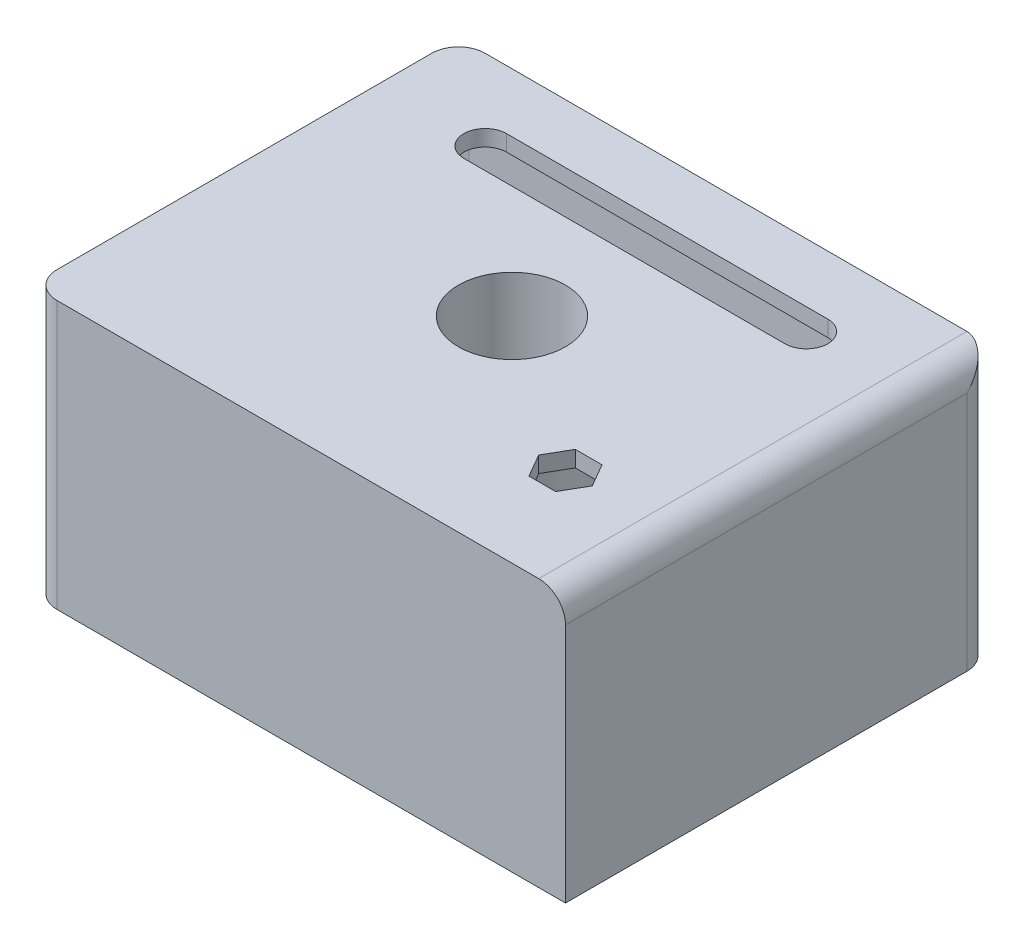
ISO-10303-21;
HEADER;
FILE_DESCRIPTION(('STEP AP214'),'2;1');
FILE_NAME('part.step','',(''),(''),'','','');
FILE_SCHEMA(('AUTOMOTIVE_DESIGN { 1 0 10303 214 1 1 1 1 }'));
ENDSEC;
DATA;
#1=APPLICATION_CONTEXT('core data for automotive mechanical design processes');
#2=APPLICATION_PROTOCOL_DEFINITION('international standard','automotive_design',2000,#1);
#3=PRODUCT_CONTEXT('',#1,'mechanical');
#4=PRODUCT('Part','Part','',(#3));
#5=PRODUCT_RELATED_PRODUCT_CATEGORY('part','',(#4));
#6=PRODUCT_DEFINITION_FORMATION('','',#4);
#7=PRODUCT_DEFINITION_CONTEXT('part definition',#1,'design');
#8=PRODUCT_DEFINITION('design','',#6,#7);
#9=PRODUCT_DEFINITION_SHAPE('','',#8);
#10=(LENGTH_UNIT() NAMED_UNIT(*) SI_UNIT(.MILLI.,.METRE.));
#11=(NAMED_UNIT(*) PLANE_ANGLE_UNIT() SI_UNIT($,.RADIAN.));
#12=(NAMED_UNIT(*) SI_UNIT($,.STERADIAN.) SOLID_ANGLE_UNIT());
#13=UNCERTAINTY_MEASURE_WITH_UNIT(LENGTH_MEASURE(1.E-05),#10,'distance_accuracy_value','');
#14=(GEOMETRIC_REPRESENTATION_CONTEXT(3) GLOBAL_UNCERTAINTY_ASSIGNED_CONTEXT((#13)) GLOBAL_UNIT_ASSIGNED_CONTEXT((#10,
#11,#12)) REPRESENTATION_CONTEXT('',''));
#15=CARTESIAN_POINT('',(0.,0.,0.));
#16=DIRECTION('',(0.,0.,1.));
#17=DIRECTION('',(1.,0.,0.));
#18=AXIS2_PLACEMENT_3D('',#15,#16,#17);
#19=CARTESIAN_POINT('',(0.,0.,0.));
#20=DIRECTION('',(0.,-1.,0.));
#21=DIRECTION('',(0.,0.,-1.));
#22=AXIS2_PLACEMENT_3D('',#19,#20,#21);
#23=PLANE('',#22);
#24=DIRECTION('',(0.,0.,1.));
#25=VECTOR('',#24,1.);
#26=CARTESIAN_POINT('',(-50.,0.,40.));
#27=LINE('',#26,#25);
#28=CARTESIAN_POINT('',(-50.,0.,-35.));
#29=VERTEX_POINT('',#28);
#30=CARTESIAN_POINT('',(-50.,0.,35.));
#31=VERTEX_POINT('',#30);
#32=EDGE_CURVE('E436',#29,#31,#27,.T.);
#33=ORIENTED_EDGE('',*,*,#32,.F.);
#34=CARTESIAN_POINT('',(-45.,0.,-35.));
#35=DIRECTION('',(0.,-1.,0.));
#36=DIRECTION('',(0.,0.,-1.));
#37=AXIS2_PLACEMENT_3D('',#34,#35,#36);
#38=CIRCLE('',#37,5.);
#39=CARTESIAN_POINT('',(-45.,0.,-40.));
#40=VERTEX_POINT('',#39);
#41=EDGE_CURVE('E466',#29,#40,#38,.T.);
#42=ORIENTED_EDGE('',*,*,#41,.T.);
#43=DIRECTION('',(-1.,0.,0.));
#44=VECTOR('',#43,1.);
#45=CARTESIAN_POINT('',(-50.,0.,-40.));
#46=LINE('',#45,#44);
#47=CARTESIAN_POINT('',(45.,0.,-40.));
#48=VERTEX_POINT('',#47);
#49=EDGE_CURVE('E427',#48,#40,#46,.T.);
#50=ORIENTED_EDGE('',*,*,#49,.F.);
#51=CARTESIAN_POINT('',(45.,0.,-35.));
#52=DIRECTION('',(0.,-1.,0.));
#53=DIRECTION('',(0.,0.,-1.));
#54=AXIS2_PLACEMENT_3D('',#51,#52,#53);
#55=CIRCLE('',#54,5.);
#56=CARTESIAN_POINT('',(50.,0.,-35.));
#57=VERTEX_POINT('',#56);
#58=EDGE_CURVE('E463',#48,#57,#55,.T.);
#59=ORIENTED_EDGE('',*,*,#58,.T.);
#60=DIRECTION('',(0.,0.,-1.));
#61=VECTOR('',#60,1.);
#62=CARTESIAN_POINT('',(50.,0.,40.));
#63=LINE('',#62,#61);
#64=CARTESIAN_POINT('',(50.,0.,40.));
#65=VERTEX_POINT('',#64);
#66=EDGE_CURVE('E444',#65,#57,#63,.T.);
#67=ORIENTED_EDGE('',*,*,#66,.F.);
#68=DIRECTION('',(1.,0.,0.));
#69=VECTOR('',#68,1.);
#70=CARTESIAN_POINT('',(-50.,0.,40.));
#71=LINE('',#70,#69);
#72=CARTESIAN_POINT('',(-45.,0.,40.));
#73=VERTEX_POINT('',#72);
#74=EDGE_CURVE('E440',#73,#65,#71,.T.);
#75=ORIENTED_EDGE('',*,*,#74,.F.);
#76=CARTESIAN_POINT('',(-45.,0.,35.));
#77=DIRECTION('',(0.,-1.,0.));
#78=DIRECTION('',(0.,0.,-1.));
#79=AXIS2_PLACEMENT_3D('',#76,#77,#78);
#80=CIRCLE('',#79,5.);
#81=EDGE_CURVE('E460',#73,#31,#80,.T.);
#82=ORIENTED_EDGE('',*,*,#81,.T.);
#83=EDGE_LOOP('',(#33,#42,#50,#59,#67,#75,#82));
#84=FACE_BOUND('',#83,.T.);
#85=CARTESIAN_POINT('',(-45.,0.,-35.));
#86=DIRECTION('',(0.,-1.,0.));
#87=DIRECTION('',(0.,0.,-1.));
#88=AXIS2_PLACEMENT_3D('',#85,#86,#87);
#89=CIRCLE('',#88,2.);
#90=CARTESIAN_POINT('',(-47.,0.,-35.));
#91=VERTEX_POINT('',#90);
#92=CARTESIAN_POINT('',(-45.,0.,-37.));
#93=VERTEX_POINT('',#92);
#94=EDGE_CURVE('E390',#91,#93,#89,.T.);
#95=ORIENTED_EDGE('',*,*,#94,.F.);
#96=DIRECTION('',(0.,0.,1.));
#97=VECTOR('',#96,1.);
#98=CARTESIAN_POINT('',(-47.,0.,0.));
#99=LINE('',#98,#97);
#100=CARTESIAN_POINT('',(-47.,0.,35.));
#101=VERTEX_POINT('',#100);
#102=EDGE_CURVE('E384',#91,#101,#99,.T.);
#103=ORIENTED_EDGE('',*,*,#102,.T.);
#104=CARTESIAN_POINT('',(-45.,0.,35.));
#105=DIRECTION('',(0.,-1.,0.));
#106=DIRECTION('',(0.,0.,-1.));
#107=AXIS2_PLACEMENT_3D('',#104,#105,#106);
#108=CIRCLE('',#107,2.);
#109=CARTESIAN_POINT('',(-45.,0.,37.));
#110=VERTEX_POINT('',#109);
#111=EDGE_CURVE('E338',#110,#101,#108,.T.);
#112=ORIENTED_EDGE('',*,*,#111,.F.);
#113=DIRECTION('',(1.,0.,0.));
#114=VECTOR('',#113,1.);
#115=CARTESIAN_POINT('',(0.,0.,37.));
#116=LINE('',#115,#114);
#117=CARTESIAN_POINT('',(47.,0.,37.));
#118=VERTEX_POINT('',#117);
#119=EDGE_CURVE('E394',#110,#118,#116,.T.);
#120=ORIENTED_EDGE('',*,*,#119,.T.);
#121=DIRECTION('',(0.,0.,-1.));
#122=VECTOR('',#121,1.);
#123=CARTESIAN_POINT('',(47.,0.,0.));
#124=LINE('',#123,#122);
#125=CARTESIAN_POINT('',(47.,0.,-35.));
#126=VERTEX_POINT('',#125);
#127=EDGE_CURVE('E401',#118,#126,#124,.T.);
#128=ORIENTED_EDGE('',*,*,#127,.T.);
#129=CARTESIAN_POINT('',(45.,0.,-35.));
#130=DIRECTION('',(0.,-1.,0.));
#131=DIRECTION('',(0.,0.,-1.));
#132=AXIS2_PLACEMENT_3D('',#129,#130,#131);
#133=CIRCLE('',#132,2.);
#134=CARTESIAN_POINT('',(45.,0.,-37.));
#135=VERTEX_POINT('',#134);
#136=EDGE_CURVE('E397',#135,#126,#133,.T.);
#137=ORIENTED_EDGE('',*,*,#136,.F.);
#138=DIRECTION('',(-1.,0.,0.));
#139=VECTOR('',#138,1.);
#140=CARTESIAN_POINT('',(0.,0.,-37.));
#141=LINE('',#140,#139);
#142=EDGE_CURVE('E334',#135,#93,#141,.T.);
#143=ORIENTED_EDGE('',*,*,#142,.T.);
#144=EDGE_LOOP('',(#95,#103,#112,#120,#128,#137,#143));
#145=FACE_BOUND('',#144,.T.);
#146=ADVANCED_FACE('F45',(#84,#145),#23,.T.);
#147=CARTESIAN_POINT('',(-50.,50.,40.));
#148=DIRECTION('',(1.,0.,0.));
#149=DIRECTION('',(0.,0.,-1.));
#150=AXIS2_PLACEMENT_3D('',#147,#148,#149);
#151=PLANE('',#150);
#152=DIRECTION('',(0.,0.,1.));
#153=VECTOR('',#152,1.);
#154=CARTESIAN_POINT('',(-50.,50.,40.));
#155=LINE('',#154,#153);
#156=CARTESIAN_POINT('',(-50.,50.,-35.));
#157=VERTEX_POINT('',#156);
#158=CARTESIAN_POINT('',(-50.,50.,35.));
#159=VERTEX_POINT('',#158);
#160=EDGE_CURVE('E422',#157,#159,#155,.T.);
#161=ORIENTED_EDGE('',*,*,#160,.F.);
#162=DIRECTION('',(0.,-1.,0.));
#163=VECTOR('',#162,1.);
#164=CARTESIAN_POINT('',(-50.,50.,-35.));
#165=LINE('',#164,#163);
#166=EDGE_CURVE('E456',#157,#29,#165,.T.);
#167=ORIENTED_EDGE('',*,*,#166,.T.);
#168=ORIENTED_EDGE('',*,*,#32,.T.);
#169=DIRECTION('',(0.,-1.,0.));
#170=VECTOR('',#169,1.);
#171=CARTESIAN_POINT('',(-50.,50.,35.));
#172=LINE('',#171,#170);
#173=EDGE_CURVE('E453',#31,#159,#172,.F.);
#174=ORIENTED_EDGE('',*,*,#173,.T.);
#175=EDGE_LOOP('',(#161,#167,#168,#174));
#176=FACE_BOUND('',#175,.T.);
#177=ADVANCED_FACE('F527',(#176),#151,.F.);
#178=CARTESIAN_POINT('',(-50.,50.,40.));
#179=DIRECTION('',(0.,0.,-1.));
#180=DIRECTION('',(-1.,0.,0.));
#181=AXIS2_PLACEMENT_3D('',#178,#179,#180);
#182=PLANE('',#181);
#183=DIRECTION('',(1.,0.,0.));
#184=VECTOR('',#183,1.);
#185=CARTESIAN_POINT('',(-50.,50.,40.));
#186=LINE('',#185,#184);
#187=CARTESIAN_POINT('',(-45.,50.,40.));
#188=VERTEX_POINT('',#187);
#189=CARTESIAN_POINT('',(45.,50.,40.));
#190=VERTEX_POINT('',#189);
#191=EDGE_CURVE('E426',#188,#190,#186,.T.);
#192=ORIENTED_EDGE('',*,*,#191,.F.);
#193=DIRECTION('',(0.,-1.,0.));
#194=VECTOR('',#193,1.);
#195=CARTESIAN_POINT('',(-45.,50.,40.));
#196=LINE('',#195,#194);
#197=EDGE_CURVE('E11',#188,#73,#196,.T.);
#198=ORIENTED_EDGE('',*,*,#197,.T.);
#199=ORIENTED_EDGE('',*,*,#74,.T.);
#200=DIRECTION('',(0.,-1.,0.));
#201=VECTOR('',#200,1.);
#202=CARTESIAN_POINT('',(50.,50.,40.));
#203=LINE('',#202,#201);
#204=CARTESIAN_POINT('',(50.,45.,40.));
#205=VERTEX_POINT('',#204);
#206=EDGE_CURVE('E435',#205,#65,#203,.T.);
#207=ORIENTED_EDGE('',*,*,#206,.F.);
#208=CARTESIAN_POINT('',(45.,45.,40.));
#209=DIRECTION('',(0.,0.,-1.));
#210=DIRECTION('',(-1.,0.,0.));
#211=AXIS2_PLACEMENT_3D('',#208,#209,#210);
#212=CIRCLE('',#211,5.);
#213=EDGE_CURVE('E55',#205,#190,#212,.F.);
#214=ORIENTED_EDGE('',*,*,#213,.T.);
#215=EDGE_LOOP('',(#192,#198,#199,#207,#214));
#216=FACE_BOUND('',#215,.T.);
#217=ADVANCED_FACE('F496',(#216),#182,.F.);
#218=CARTESIAN_POINT('',(50.,50.,40.));
#219=DIRECTION('',(-1.,0.,0.));
#220=DIRECTION('',(0.,0.,1.));
#221=AXIS2_PLACEMENT_3D('',#218,#219,#220);
#222=PLANE('',#221);
#223=ORIENTED_EDGE('',*,*,#66,.T.);
#224=DIRECTION('',(0.,-1.,0.));
#225=VECTOR('',#224,1.);
#226=CARTESIAN_POINT('',(50.,50.,-35.));
#227=LINE('',#226,#225);
#228=CARTESIAN_POINT('',(50.,45.,-35.));
#229=VERTEX_POINT('',#228);
#230=EDGE_CURVE('E488',#57,#229,#227,.F.);
#231=ORIENTED_EDGE('',*,*,#230,.T.);
#232=DIRECTION('',(0.,0.,-1.));
#233=VECTOR('',#232,1.);
#234=CARTESIAN_POINT('',(50.,45.,40.));
#235=LINE('',#234,#233);
#236=EDGE_CURVE('E485',#229,#205,#235,.F.);
#237=ORIENTED_EDGE('',*,*,#236,.T.);
#238=ORIENTED_EDGE('',*,*,#206,.T.);
#239=EDGE_LOOP('',(#223,#231,#237,#238));
#240=FACE_BOUND('',#239,.T.);
#241=ADVANCED_FACE('F532',(#240),#222,.F.);
#242=CARTESIAN_POINT('',(-50.,50.,-40.));
#243=DIRECTION('',(0.,0.,1.));
#244=DIRECTION('',(1.,0.,0.));
#245=AXIS2_PLACEMENT_3D('',#242,#243,#244);
#246=PLANE('',#245);
#247=ORIENTED_EDGE('',*,*,#49,.T.);
#248=DIRECTION('',(0.,-1.,0.));
#249=VECTOR('',#248,1.);
#250=CARTESIAN_POINT('',(-45.,50.,-40.));
#251=LINE('',#250,#249);
#252=CARTESIAN_POINT('',(-45.,50.,-40.));
#253=VERTEX_POINT('',#252);
#254=EDGE_CURVE('E473',#40,#253,#251,.F.);
#255=ORIENTED_EDGE('',*,*,#254,.T.);
#256=DIRECTION('',(-1.,0.,0.));
#257=VECTOR('',#256,1.);
#258=CARTESIAN_POINT('',(-50.,50.,-40.));
#259=LINE('',#258,#257);
#260=CARTESIAN_POINT('',(45.,50.,-40.));
#261=VERTEX_POINT('',#260);
#262=EDGE_CURVE('E431',#261,#253,#259,.T.);
#263=ORIENTED_EDGE('',*,*,#262,.F.);
#264=DIRECTION('',(0.,-1.,0.));
#265=VECTOR('',#264,1.);
#266=CARTESIAN_POINT('',(45.,50.,-40.));
#267=LINE('',#266,#265);
#268=EDGE_CURVE('E469',#261,#48,#267,.T.);
#269=ORIENTED_EDGE('',*,*,#268,.T.);
#270=EDGE_LOOP('',(#247,#255,#263,#269));
#271=FACE_BOUND('',#270,.T.);
#272=ADVANCED_FACE('F515',(#271),#246,.F.);
#273=CARTESIAN_POINT('',(0.,50.,0.));
#274=DIRECTION('',(0.,-1.,0.));
#275=DIRECTION('',(0.,0.,-1.));
#276=AXIS2_PLACEMENT_3D('',#273,#274,#275);
#277=PLANE('',#276);
#278=DIRECTION('',(-0.500000000000001,0.,-0.866025403784438));
#279=VECTOR('',#278,1.);
#280=CARTESIAN_POINT('',(35.,50.,20.));
#281=LINE('',#280,#279);
#282=CARTESIAN_POINT('',(35.,50.,20.));
#283=VERTEX_POINT('',#282);
#284=CARTESIAN_POINT('',(32.5,50.,15.6698729810778));
#285=VERTEX_POINT('',#284);
#286=EDGE_CURVE('E256',#283,#285,#281,.T.);
#287=ORIENTED_EDGE('',*,*,#286,.F.);
#288=DIRECTION('',(0.499999999999995,0.,-0.866025403784442));
#289=VECTOR('',#288,1.);
#290=CARTESIAN_POINT('',(32.5,50.,24.3301270189222));
#291=LINE('',#290,#289);
#292=CARTESIAN_POINT('',(32.5,50.,24.3301270189222));
#293=VERTEX_POINT('',#292);
#294=EDGE_CURVE('E62',#293,#283,#291,.T.);
#295=ORIENTED_EDGE('',*,*,#294,.F.);
#296=DIRECTION('',(1.,0.,0.));
#297=VECTOR('',#296,1.);
#298=CARTESIAN_POINT('',(27.5,50.,24.3301270189222));
#299=LINE('',#298,#297);
#300=CARTESIAN_POINT('',(27.5,50.,24.3301270189222));
#301=VERTEX_POINT('',#300);
#302=EDGE_CURVE('E236',#301,#293,#299,.T.);
#303=ORIENTED_EDGE('',*,*,#302,.F.);
#304=DIRECTION('',(0.500000000000007,0.,0.866025403784434));
#305=VECTOR('',#304,1.);
#306=CARTESIAN_POINT('',(25.,50.,20.));
#307=LINE('',#306,#305);
#308=CARTESIAN_POINT('',(25.,50.,20.));
#309=VERTEX_POINT('',#308);
#310=EDGE_CURVE('E240',#309,#301,#307,.T.);
#311=ORIENTED_EDGE('',*,*,#310,.F.);
#312=DIRECTION('',(-0.499999999999995,0.,0.866025403784442));
#313=VECTOR('',#312,1.);
#314=CARTESIAN_POINT('',(27.5,50.,15.6698729810778));
#315=LINE('',#314,#313);
#316=CARTESIAN_POINT('',(27.5,50.,15.6698729810778));
#317=VERTEX_POINT('',#316);
#318=EDGE_CURVE('E263',#317,#309,#315,.T.);
#319=ORIENTED_EDGE('',*,*,#318,.F.);
#320=DIRECTION('',(-1.,0.,0.));
#321=VECTOR('',#320,1.);
#322=CARTESIAN_POINT('',(32.5,50.,15.6698729810778));
#323=LINE('',#322,#321);
#324=EDGE_CURVE('E259',#285,#317,#323,.T.);
#325=ORIENTED_EDGE('',*,*,#324,.F.);
#326=EDGE_LOOP('',(#287,#295,#303,#311,#319,#325));
#327=FACE_BOUND('',#326,.T.);
#328=DIRECTION('',(1.,0.,0.));
#329=VECTOR('',#328,1.);
#330=CARTESIAN_POINT('',(-30.,50.,-21.));
#331=LINE('',#330,#329);
#332=CARTESIAN_POINT('',(-30.,50.,-21.));
#333=VERTEX_POINT('',#332);
#334=CARTESIAN_POINT('',(30.,50.,-21.));
#335=VERTEX_POINT('',#334);
#336=EDGE_CURVE('E305',#333,#335,#331,.T.);
#337=ORIENTED_EDGE('',*,*,#336,.F.);
#338=CARTESIAN_POINT('',(-30.,50.,-25.));
#339=DIRECTION('',(0.,1.,0.));
#340=DIRECTION('',(0.,0.,1.));
#341=AXIS2_PLACEMENT_3D('',#338,#339,#340);
#342=CIRCLE('',#341,4.);
#343=CARTESIAN_POINT('',(-30.,50.,-29.));
#344=VERTEX_POINT('',#343);
#345=EDGE_CURVE('E273',#344,#333,#342,.T.);
#346=ORIENTED_EDGE('',*,*,#345,.F.);
#347=DIRECTION('',(-1.,0.,0.));
#348=VECTOR('',#347,1.);
#349=CARTESIAN_POINT('',(-30.,50.,-29.));
#350=LINE('',#349,#348);
#351=CARTESIAN_POINT('',(30.,50.,-29.));
#352=VERTEX_POINT('',#351);
#353=EDGE_CURVE('E290',#352,#344,#350,.T.);
#354=ORIENTED_EDGE('',*,*,#353,.F.);
#355=CARTESIAN_POINT('',(30.,50.,-25.));
#356=DIRECTION('',(0.,1.,0.));
#357=DIRECTION('',(0.,0.,1.));
#358=AXIS2_PLACEMENT_3D('',#355,#356,#357);
#359=CIRCLE('',#358,4.);
#360=EDGE_CURVE('E309',#335,#352,#359,.T.);
#361=ORIENTED_EDGE('',*,*,#360,.F.);
#362=EDGE_LOOP('',(#337,#346,#354,#361));
#363=FACE_BOUND('',#362,.T.);
#364=CARTESIAN_POINT('',(0.,50.,0.));
#365=DIRECTION('',(0.,1.,0.));
#366=DIRECTION('',(0.,0.,1.));
#367=AXIS2_PLACEMENT_3D('',#364,#365,#366);
#368=CIRCLE('',#367,10.);
#369=CARTESIAN_POINT('',(0.,50.,10.));
#370=VERTEX_POINT('',#369);
#371=EDGE_CURVE('E369',#370,#370,#368,.T.);
#372=ORIENTED_EDGE('',*,*,#371,.F.);
#373=EDGE_LOOP('',(#372));
#374=FACE_BOUND('',#373,.T.);
#375=ORIENTED_EDGE('',*,*,#262,.T.);
#376=CARTESIAN_POINT('',(-45.,50.,-35.));
#377=DIRECTION('',(0.,-1.,0.));
#378=DIRECTION('',(0.,0.,-1.));
#379=AXIS2_PLACEMENT_3D('',#376,#377,#378);
#380=CIRCLE('',#379,5.);
#381=EDGE_CURVE('E482',#253,#157,#380,.F.);
#382=ORIENTED_EDGE('',*,*,#381,.T.);
#383=ORIENTED_EDGE('',*,*,#160,.T.);
#384=CARTESIAN_POINT('',(-45.,50.,35.));
#385=DIRECTION('',(0.,-1.,0.));
#386=DIRECTION('',(0.,0.,-1.));
#387=AXIS2_PLACEMENT_3D('',#384,#385,#386);
#388=CIRCLE('',#387,5.);
#389=EDGE_CURVE('E479',#159,#188,#388,.F.);
#390=ORIENTED_EDGE('',*,*,#389,.T.);
#391=ORIENTED_EDGE('',*,*,#191,.T.);
#392=DIRECTION('',(0.,0.,-1.));
#393=VECTOR('',#392,1.);
#394=CARTESIAN_POINT('',(45.,50.,0.));
#395=LINE('',#394,#393);
#396=EDGE_CURVE('E476',#190,#261,#395,.T.);
#397=ORIENTED_EDGE('',*,*,#396,.T.);
#398=EDGE_LOOP('',(#375,#382,#383,#390,#391,#397));
#399=FACE_BOUND('',#398,.T.);
#400=ADVANCED_FACE('F502',(#327,#363,#374,#399),#277,.F.);
#401=CARTESIAN_POINT('',(0.,0.,0.));
#402=DIRECTION('',(0.,-1.,0.));
#403=DIRECTION('',(0.,0.,-1.));
#404=AXIS2_PLACEMENT_3D('',#401,#402,#403);
#405=CIRCLE('',#404,13.);
#406=CARTESIAN_POINT('',(0.,0.,-13.));
#407=VERTEX_POINT('',#406);
#408=EDGE_CURVE('E346',#407,#407,#405,.F.);
#409=ORIENTED_EDGE('',*,*,#408,.F.);
#410=EDGE_LOOP('',(#409));
#411=FACE_BOUND('',#410,.T.);
#412=CARTESIAN_POINT('',(0.,0.,0.));
#413=DIRECTION('',(0.,1.,0.));
#414=DIRECTION('',(0.,0.,1.));
#415=AXIS2_PLACEMENT_3D('',#412,#413,#414);
#416=CIRCLE('',#415,10.);
#417=CARTESIAN_POINT('',(0.,0.,10.));
#418=VERTEX_POINT('',#417);
#419=EDGE_CURVE('E415',#418,#418,#416,.T.);
#420=ORIENTED_EDGE('',*,*,#419,.T.);
#421=EDGE_LOOP('',(#420));
#422=FACE_BOUND('',#421,.T.);
#423=ADVANCED_FACE('F543',(#411,#422),#23,.T.);
#424=CARTESIAN_POINT('',(-45.,50.,-35.));
#425=DIRECTION('',(0.,-1.,0.));
#426=DIRECTION('',(0.,0.,-1.));
#427=AXIS2_PLACEMENT_3D('',#424,#425,#426);
#428=CYLINDRICAL_SURFACE('',#427,5.);
#429=ORIENTED_EDGE('',*,*,#381,.F.);
#430=ORIENTED_EDGE('',*,*,#254,.F.);
#431=ORIENTED_EDGE('',*,*,#41,.F.);
#432=ORIENTED_EDGE('',*,*,#166,.F.);
#433=EDGE_LOOP('',(#429,#430,#431,#432));
#434=FACE_BOUND('',#433,.T.);
#435=ADVANCED_FACE('F524',(#434),#428,.T.);
#436=CARTESIAN_POINT('',(45.,45.,0.));
#437=DIRECTION('',(0.,0.,-1.));
#438=DIRECTION('',(-1.,0.,0.));
#439=AXIS2_PLACEMENT_3D('',#436,#437,#438);
#440=CYLINDRICAL_SURFACE('',#439,5.);
#441=ORIENTED_EDGE('',*,*,#213,.F.);
#442=ORIENTED_EDGE('',*,*,#236,.F.);
#443=CARTESIAN_POINT('',(45.,45.,-35.));
#444=DIRECTION('',(0.,-0.707106781186547,-0.707106781186547));
#445=DIRECTION('',(0.,0.707106781186547,-0.707106781186547));
#446=AXIS2_PLACEMENT_3D('',#443,#444,#445);
#447=ELLIPSE('',#446,7.07106781186547,5.);
#448=EDGE_CURVE('E49',#261,#229,#447,.T.);
#449=ORIENTED_EDGE('',*,*,#448,.F.);
#450=ORIENTED_EDGE('',*,*,#396,.F.);
#451=EDGE_LOOP('',(#441,#442,#449,#450));
#452=FACE_BOUND('',#451,.T.);
#453=ADVANCED_FACE('F506',(#452),#440,.T.);
#454=CARTESIAN_POINT('',(45.,50.,-35.));
#455=DIRECTION('',(0.,-1.,0.));
#456=DIRECTION('',(0.,0.,-1.));
#457=AXIS2_PLACEMENT_3D('',#454,#455,#456);
#458=CYLINDRICAL_SURFACE('',#457,5.);
#459=ORIENTED_EDGE('',*,*,#448,.T.);
#460=ORIENTED_EDGE('',*,*,#230,.F.);
#461=ORIENTED_EDGE('',*,*,#58,.F.);
#462=ORIENTED_EDGE('',*,*,#268,.F.);
#463=EDGE_LOOP('',(#459,#460,#461,#462));
#464=FACE_BOUND('',#463,.T.);
#465=ADVANCED_FACE('F512',(#464),#458,.T.);
#466=CARTESIAN_POINT('',(-45.,50.,35.));
#467=DIRECTION('',(0.,-1.,0.));
#468=DIRECTION('',(0.,0.,-1.));
#469=AXIS2_PLACEMENT_3D('',#466,#467,#468);
#470=CYLINDRICAL_SURFACE('',#469,5.);
#471=ORIENTED_EDGE('',*,*,#389,.F.);
#472=ORIENTED_EDGE('',*,*,#173,.F.);
#473=ORIENTED_EDGE('',*,*,#81,.F.);
#474=ORIENTED_EDGE('',*,*,#197,.F.);
#475=EDGE_LOOP('',(#471,#472,#473,#474));
#476=FACE_BOUND('',#475,.T.);
#477=ADVANCED_FACE('F47',(#476),#470,.T.);
#478=CARTESIAN_POINT('',(0.,0.,0.));
#479=DIRECTION('',(0.,1.,0.));
#480=DIRECTION('',(0.,0.,1.));
#481=AXIS2_PLACEMENT_3D('',#478,#479,#480);
#482=CYLINDRICAL_SURFACE('',#481,10.);
#483=ORIENTED_EDGE('',*,*,#419,.F.);
#484=EDGE_LOOP('',(#483));
#485=FACE_BOUND('',#484,.T.);
#486=ORIENTED_EDGE('',*,*,#371,.T.);
#487=EDGE_LOOP('',(#486));
#488=FACE_BOUND('',#487,.T.);
#489=ADVANCED_FACE('F563',(#485,#488),#482,.F.);
#490=CARTESIAN_POINT('',(-47.,50.,40.));
#491=DIRECTION('',(1.,0.,0.));
#492=DIRECTION('',(0.,0.,-1.));
#493=AXIS2_PLACEMENT_3D('',#490,#491,#492);
#494=PLANE('',#493);
#495=DIRECTION('',(0.,0.,1.));
#496=VECTOR('',#495,1.);
#497=CARTESIAN_POINT('',(-47.,47.,0.));
#498=LINE('',#497,#496);
#499=CARTESIAN_POINT('',(-47.,47.,-35.));
#500=VERTEX_POINT('',#499);
#501=CARTESIAN_POINT('',(-47.,47.,35.));
#502=VERTEX_POINT('',#501);
#503=EDGE_CURVE('E329',#500,#502,#498,.T.);
#504=ORIENTED_EDGE('',*,*,#503,.T.);
#505=DIRECTION('',(0.,1.,0.));
#506=VECTOR('',#505,1.);
#507=CARTESIAN_POINT('',(-47.,50.,35.));
#508=LINE('',#507,#506);
#509=EDGE_CURVE('E339',#101,#502,#508,.T.);
#510=ORIENTED_EDGE('',*,*,#509,.F.);
#511=ORIENTED_EDGE('',*,*,#102,.F.);
#512=DIRECTION('',(0.,1.,0.));
#513=VECTOR('',#512,1.);
#514=CARTESIAN_POINT('',(-47.,50.,-35.));
#515=LINE('',#514,#513);
#516=EDGE_CURVE('E335',#500,#91,#515,.F.);
#517=ORIENTED_EDGE('',*,*,#516,.F.);
#518=EDGE_LOOP('',(#504,#510,#511,#517));
#519=FACE_BOUND('',#518,.T.);
#520=ADVANCED_FACE('F565',(#519),#494,.T.);
#521=CARTESIAN_POINT('',(-50.,50.,37.));
#522=DIRECTION('',(0.,0.,-1.));
#523=DIRECTION('',(-1.,0.,0.));
#524=AXIS2_PLACEMENT_3D('',#521,#522,#523);
#525=PLANE('',#524);
#526=DIRECTION('',(1.,0.,0.));
#527=VECTOR('',#526,1.);
#528=CARTESIAN_POINT('',(0.,47.,37.));
#529=LINE('',#528,#527);
#530=CARTESIAN_POINT('',(-45.,47.,37.));
#531=VERTEX_POINT('',#530);
#532=CARTESIAN_POINT('',(45.,47.,37.));
#533=VERTEX_POINT('',#532);
#534=EDGE_CURVE('E333',#531,#533,#529,.T.);
#535=ORIENTED_EDGE('',*,*,#534,.T.);
#536=CARTESIAN_POINT('',(45.,45.,37.));
#537=DIRECTION('',(0.,0.,-1.));
#538=DIRECTION('',(-1.,0.,0.));
#539=AXIS2_PLACEMENT_3D('',#536,#537,#538);
#540=CIRCLE('',#539,2.);
#541=CARTESIAN_POINT('',(47.,45.,37.));
#542=VERTEX_POINT('',#541);
#543=EDGE_CURVE('E370',#542,#533,#540,.F.);
#544=ORIENTED_EDGE('',*,*,#543,.F.);
#545=DIRECTION('',(0.,-1.,0.));
#546=VECTOR('',#545,1.);
#547=CARTESIAN_POINT('',(47.,50.,37.));
#548=LINE('',#547,#546);
#549=EDGE_CURVE('E342',#542,#118,#548,.T.);
#550=ORIENTED_EDGE('',*,*,#549,.T.);
#551=ORIENTED_EDGE('',*,*,#119,.F.);
#552=DIRECTION('',(0.,1.,0.));
#553=VECTOR('',#552,1.);
#554=CARTESIAN_POINT('',(-45.,50.,37.));
#555=LINE('',#554,#553);
#556=EDGE_CURVE('E365',#531,#110,#555,.F.);
#557=ORIENTED_EDGE('',*,*,#556,.F.);
#558=EDGE_LOOP('',(#535,#544,#550,#551,#557));
#559=FACE_BOUND('',#558,.T.);
#560=ADVANCED_FACE('F572',(#559),#525,.T.);
#561=CARTESIAN_POINT('',(47.,50.,40.));
#562=DIRECTION('',(-1.,0.,0.));
#563=DIRECTION('',(0.,0.,1.));
#564=AXIS2_PLACEMENT_3D('',#561,#562,#563);
#565=PLANE('',#564);
#566=ORIENTED_EDGE('',*,*,#127,.F.);
#567=ORIENTED_EDGE('',*,*,#549,.F.);
#568=DIRECTION('',(0.,0.,1.));
#569=VECTOR('',#568,1.);
#570=CARTESIAN_POINT('',(47.,45.,40.));
#571=LINE('',#570,#569);
#572=CARTESIAN_POINT('',(47.,45.,-35.));
#573=VERTEX_POINT('',#572);
#574=EDGE_CURVE('E354',#573,#542,#571,.T.);
#575=ORIENTED_EDGE('',*,*,#574,.F.);
#576=DIRECTION('',(0.,1.,0.));
#577=VECTOR('',#576,1.);
#578=CARTESIAN_POINT('',(47.,50.,-35.));
#579=LINE('',#578,#577);
#580=EDGE_CURVE('E375',#126,#573,#579,.T.);
#581=ORIENTED_EDGE('',*,*,#580,.F.);
#582=EDGE_LOOP('',(#566,#567,#575,#581));
#583=FACE_BOUND('',#582,.T.);
#584=ADVANCED_FACE('F602',(#583),#565,.T.);
#585=CARTESIAN_POINT('',(-50.,50.,-37.));
#586=DIRECTION('',(0.,0.,1.));
#587=DIRECTION('',(1.,0.,0.));
#588=AXIS2_PLACEMENT_3D('',#585,#586,#587);
#589=PLANE('',#588);
#590=ORIENTED_EDGE('',*,*,#142,.F.);
#591=DIRECTION('',(0.,1.,0.));
#592=VECTOR('',#591,1.);
#593=CARTESIAN_POINT('',(45.,50.,-37.));
#594=LINE('',#593,#592);
#595=CARTESIAN_POINT('',(45.,47.,-37.));
#596=VERTEX_POINT('',#595);
#597=EDGE_CURVE('E387',#596,#135,#594,.F.);
#598=ORIENTED_EDGE('',*,*,#597,.F.);
#599=DIRECTION('',(-1.,0.,0.));
#600=VECTOR('',#599,1.);
#601=CARTESIAN_POINT('',(0.,47.,-37.));
#602=LINE('',#601,#600);
#603=CARTESIAN_POINT('',(-45.,47.,-37.));
#604=VERTEX_POINT('',#603);
#605=EDGE_CURVE('E347',#596,#604,#602,.T.);
#606=ORIENTED_EDGE('',*,*,#605,.T.);
#607=DIRECTION('',(0.,1.,0.));
#608=VECTOR('',#607,1.);
#609=CARTESIAN_POINT('',(-45.,50.,-37.));
#610=LINE('',#609,#608);
#611=EDGE_CURVE('E364',#93,#604,#610,.T.);
#612=ORIENTED_EDGE('',*,*,#611,.F.);
#613=EDGE_LOOP('',(#590,#598,#606,#612));
#614=FACE_BOUND('',#613,.T.);
#615=ADVANCED_FACE('F599',(#614),#589,.T.);
#616=CARTESIAN_POINT('',(0.,47.,0.));
#617=DIRECTION('',(0.,-1.,0.));
#618=DIRECTION('',(0.,0.,-1.));
#619=AXIS2_PLACEMENT_3D('',#616,#617,#618);
#620=PLANE('',#619);
#621=DIRECTION('',(0.499999999999995,0.,-0.866025403784442));
#622=VECTOR('',#621,1.);
#623=CARTESIAN_POINT('',(32.5,47.,24.3301270189222));
#624=LINE('',#623,#622);
#625=CARTESIAN_POINT('',(32.5,47.,24.3301270189222));
#626=VERTEX_POINT('',#625);
#627=CARTESIAN_POINT('',(35.,47.,20.));
#628=VERTEX_POINT('',#627);
#629=EDGE_CURVE('E216',#626,#628,#624,.T.);
#630=ORIENTED_EDGE('',*,*,#629,.T.);
#631=DIRECTION('',(-0.500000000000001,0.,-0.866025403784438));
#632=VECTOR('',#631,1.);
#633=CARTESIAN_POINT('',(35.,47.,20.));
#634=LINE('',#633,#632);
#635=CARTESIAN_POINT('',(32.5,47.,15.6698729810778));
#636=VERTEX_POINT('',#635);
#637=EDGE_CURVE('E226',#628,#636,#634,.T.);
#638=ORIENTED_EDGE('',*,*,#637,.T.);
#639=DIRECTION('',(-1.,0.,0.));
#640=VECTOR('',#639,1.);
#641=CARTESIAN_POINT('',(32.5,47.,15.6698729810778));
#642=LINE('',#641,#640);
#643=CARTESIAN_POINT('',(27.5,47.,15.6698729810778));
#644=VERTEX_POINT('',#643);
#645=EDGE_CURVE('E70',#636,#644,#642,.T.);
#646=ORIENTED_EDGE('',*,*,#645,.T.);
#647=DIRECTION('',(-0.499999999999995,0.,0.866025403784442));
#648=VECTOR('',#647,1.);
#649=CARTESIAN_POINT('',(27.5,47.,15.6698729810778));
#650=LINE('',#649,#648);
#651=CARTESIAN_POINT('',(25.,47.,20.));
#652=VERTEX_POINT('',#651);
#653=EDGE_CURVE('E245',#644,#652,#650,.T.);
#654=ORIENTED_EDGE('',*,*,#653,.T.);
#655=DIRECTION('',(0.500000000000007,0.,0.866025403784434));
#656=VECTOR('',#655,1.);
#657=CARTESIAN_POINT('',(25.,47.,20.));
#658=LINE('',#657,#656);
#659=CARTESIAN_POINT('',(27.5,47.,24.3301270189222));
#660=VERTEX_POINT('',#659);
#661=EDGE_CURVE('E249',#652,#660,#658,.T.);
#662=ORIENTED_EDGE('',*,*,#661,.T.);
#663=DIRECTION('',(1.,0.,0.));
#664=VECTOR('',#663,1.);
#665=CARTESIAN_POINT('',(27.5,47.,24.3301270189222));
#666=LINE('',#665,#664);
#667=EDGE_CURVE('E223',#660,#626,#666,.T.);
#668=ORIENTED_EDGE('',*,*,#667,.T.);
#669=EDGE_LOOP('',(#630,#638,#646,#654,#662,#668));
#670=FACE_BOUND('',#669,.T.);
#671=CARTESIAN_POINT('',(-30.,47.,-25.));
#672=DIRECTION('',(0.,1.,0.));
#673=DIRECTION('',(0.,0.,1.));
#674=AXIS2_PLACEMENT_3D('',#671,#672,#673);
#675=CIRCLE('',#674,4.);
#676=CARTESIAN_POINT('',(-30.,47.,-29.));
#677=VERTEX_POINT('',#676);
#678=CARTESIAN_POINT('',(-30.,47.,-21.));
#679=VERTEX_POINT('',#678);
#680=EDGE_CURVE('E285',#677,#679,#675,.T.);
#681=ORIENTED_EDGE('',*,*,#680,.T.);
#682=DIRECTION('',(1.,0.,0.));
#683=VECTOR('',#682,1.);
#684=CARTESIAN_POINT('',(-30.,47.,-21.));
#685=LINE('',#684,#683);
#686=CARTESIAN_POINT('',(30.,47.,-21.));
#687=VERTEX_POINT('',#686);
#688=EDGE_CURVE('E289',#679,#687,#685,.T.);
#689=ORIENTED_EDGE('',*,*,#688,.T.);
#690=CARTESIAN_POINT('',(30.,47.,-25.));
#691=DIRECTION('',(0.,1.,0.));
#692=DIRECTION('',(0.,0.,1.));
#693=AXIS2_PLACEMENT_3D('',#690,#691,#692);
#694=CIRCLE('',#693,4.);
#695=CARTESIAN_POINT('',(30.,47.,-29.));
#696=VERTEX_POINT('',#695);
#697=EDGE_CURVE('E294',#687,#696,#694,.T.);
#698=ORIENTED_EDGE('',*,*,#697,.T.);
#699=DIRECTION('',(-1.,0.,0.));
#700=VECTOR('',#699,1.);
#701=CARTESIAN_POINT('',(-30.,47.,-29.));
#702=LINE('',#701,#700);
#703=EDGE_CURVE('E298',#696,#677,#702,.T.);
#704=ORIENTED_EDGE('',*,*,#703,.T.);
#705=EDGE_LOOP('',(#681,#689,#698,#704));
#706=FACE_BOUND('',#705,.T.);
#707=CARTESIAN_POINT('',(0.,47.,0.));
#708=DIRECTION('',(0.,-1.,0.));
#709=DIRECTION('',(0.,0.,-1.));
#710=AXIS2_PLACEMENT_3D('',#707,#708,#709);
#711=CIRCLE('',#710,13.);
#712=CARTESIAN_POINT('',(0.,47.,-13.));
#713=VERTEX_POINT('',#712);
#714=EDGE_CURVE('E319',#713,#713,#711,.F.);
#715=ORIENTED_EDGE('',*,*,#714,.T.);
#716=EDGE_LOOP('',(#715));
#717=FACE_BOUND('',#716,.T.);
#718=ORIENTED_EDGE('',*,*,#605,.F.);
#719=DIRECTION('',(0.,0.,-1.));
#720=VECTOR('',#719,1.);
#721=CARTESIAN_POINT('',(45.,47.,0.));
#722=LINE('',#721,#720);
#723=EDGE_CURVE('E358',#533,#596,#722,.T.);
#724=ORIENTED_EDGE('',*,*,#723,.F.);
#725=ORIENTED_EDGE('',*,*,#534,.F.);
#726=CARTESIAN_POINT('',(-45.,47.,35.));
#727=DIRECTION('',(0.,-1.,0.));
#728=DIRECTION('',(0.,0.,-1.));
#729=AXIS2_PLACEMENT_3D('',#726,#727,#728);
#730=CIRCLE('',#729,2.);
#731=EDGE_CURVE('E355',#502,#531,#730,.F.);
#732=ORIENTED_EDGE('',*,*,#731,.F.);
#733=ORIENTED_EDGE('',*,*,#503,.F.);
#734=CARTESIAN_POINT('',(-45.,47.,-35.));
#735=DIRECTION('',(0.,-1.,0.));
#736=DIRECTION('',(0.,0.,-1.));
#737=AXIS2_PLACEMENT_3D('',#734,#735,#736);
#738=CIRCLE('',#737,2.);
#739=EDGE_CURVE('E351',#604,#500,#738,.F.);
#740=ORIENTED_EDGE('',*,*,#739,.F.);
#741=EDGE_LOOP('',(#718,#724,#725,#732,#733,#740));
#742=FACE_BOUND('',#741,.T.);
#743=ADVANCED_FACE('F231',(#670,#706,#717,#742),#620,.T.);
#744=CARTESIAN_POINT('',(-45.,50.,-35.));
#745=DIRECTION('',(0.,-1.,0.));
#746=DIRECTION('',(0.,0.,-1.));
#747=AXIS2_PLACEMENT_3D('',#744,#745,#746);
#748=CYLINDRICAL_SURFACE('',#747,2.);
#749=ORIENTED_EDGE('',*,*,#739,.T.);
#750=ORIENTED_EDGE('',*,*,#516,.T.);
#751=ORIENTED_EDGE('',*,*,#94,.T.);
#752=ORIENTED_EDGE('',*,*,#611,.T.);
#753=EDGE_LOOP('',(#749,#750,#751,#752));
#754=FACE_BOUND('',#753,.T.);
#755=ADVANCED_FACE('F592',(#754),#748,.F.);
#756=CARTESIAN_POINT('',(45.,45.,0.));
#757=DIRECTION('',(0.,0.,-1.));
#758=DIRECTION('',(-1.,0.,0.));
#759=AXIS2_PLACEMENT_3D('',#756,#757,#758);
#760=CYLINDRICAL_SURFACE('',#759,2.);
#761=ORIENTED_EDGE('',*,*,#543,.T.);
#762=ORIENTED_EDGE('',*,*,#723,.T.);
#763=CARTESIAN_POINT('',(45.,45.,-35.));
#764=DIRECTION('',(0.,-0.707106781186547,-0.707106781186547));
#765=DIRECTION('',(0.,-0.707106781186547,0.707106781186547));
#766=AXIS2_PLACEMENT_3D('',#763,#764,#765);
#767=ELLIPSE('',#766,2.82842712474619,2.);
#768=EDGE_CURVE('E380',#596,#573,#767,.T.);
#769=ORIENTED_EDGE('',*,*,#768,.T.);
#770=ORIENTED_EDGE('',*,*,#574,.T.);
#771=EDGE_LOOP('',(#761,#762,#769,#770));
#772=FACE_BOUND('',#771,.T.);
#773=ADVANCED_FACE('F588',(#772),#760,.F.);
#774=CARTESIAN_POINT('',(45.,50.,-35.));
#775=DIRECTION('',(0.,-1.,0.));
#776=DIRECTION('',(0.,0.,-1.));
#777=AXIS2_PLACEMENT_3D('',#774,#775,#776);
#778=CYLINDRICAL_SURFACE('',#777,2.);
#779=ORIENTED_EDGE('',*,*,#768,.F.);
#780=ORIENTED_EDGE('',*,*,#597,.T.);
#781=ORIENTED_EDGE('',*,*,#136,.T.);
#782=ORIENTED_EDGE('',*,*,#580,.T.);
#783=EDGE_LOOP('',(#779,#780,#781,#782));
#784=FACE_BOUND('',#783,.T.);
#785=ADVANCED_FACE('F584',(#784),#778,.F.);
#786=CARTESIAN_POINT('',(-45.,50.,35.));
#787=DIRECTION('',(0.,-1.,0.));
#788=DIRECTION('',(0.,0.,-1.));
#789=AXIS2_PLACEMENT_3D('',#786,#787,#788);
#790=CYLINDRICAL_SURFACE('',#789,2.);
#791=ORIENTED_EDGE('',*,*,#731,.T.);
#792=ORIENTED_EDGE('',*,*,#556,.T.);
#793=ORIENTED_EDGE('',*,*,#111,.T.);
#794=ORIENTED_EDGE('',*,*,#509,.T.);
#795=EDGE_LOOP('',(#791,#792,#793,#794));
#796=FACE_BOUND('',#795,.T.);
#797=ADVANCED_FACE('F580',(#796),#790,.F.);
#798=CARTESIAN_POINT('',(0.,0.,0.));
#799=DIRECTION('',(0.,1.,0.));
#800=DIRECTION('',(0.,0.,1.));
#801=AXIS2_PLACEMENT_3D('',#798,#799,#800);
#802=CYLINDRICAL_SURFACE('',#801,13.);
#803=ORIENTED_EDGE('',*,*,#408,.T.);
#804=EDGE_LOOP('',(#803));
#805=FACE_BOUND('',#804,.T.);
#806=ORIENTED_EDGE('',*,*,#714,.F.);
#807=EDGE_LOOP('',(#806));
#808=FACE_BOUND('',#807,.T.);
#809=ADVANCED_FACE('F576',(#805,#808),#802,.T.);
#810=CARTESIAN_POINT('',(-30.,47.,-25.));
#811=DIRECTION('',(0.,1.,0.));
#812=DIRECTION('',(0.,0.,1.));
#813=AXIS2_PLACEMENT_3D('',#810,#811,#812);
#814=CYLINDRICAL_SURFACE('',#813,4.);
#815=ORIENTED_EDGE('',*,*,#345,.T.);
#816=DIRECTION('',(0.,1.,0.));
#817=VECTOR('',#816,1.);
#818=CARTESIAN_POINT('',(-30.,47.,-21.));
#819=LINE('',#818,#817);
#820=EDGE_CURVE('E302',#679,#333,#819,.T.);
#821=ORIENTED_EDGE('',*,*,#820,.F.);
#822=ORIENTED_EDGE('',*,*,#680,.F.);
#823=DIRECTION('',(0.,1.,0.));
#824=VECTOR('',#823,1.);
#825=CARTESIAN_POINT('',(-30.,47.,-29.));
#826=LINE('',#825,#824);
#827=EDGE_CURVE('E316',#677,#344,#826,.T.);
#828=ORIENTED_EDGE('',*,*,#827,.T.);
#829=EDGE_LOOP('',(#815,#821,#822,#828));
#830=FACE_BOUND('',#829,.T.);
#831=ADVANCED_FACE('F579',(#830),#814,.F.);
#832=CARTESIAN_POINT('',(-30.,47.,-29.));
#833=DIRECTION('',(0.,0.,-1.));
#834=DIRECTION('',(-1.,0.,0.));
#835=AXIS2_PLACEMENT_3D('',#832,#833,#834);
#836=PLANE('',#835);
#837=ORIENTED_EDGE('',*,*,#353,.T.);
#838=ORIENTED_EDGE('',*,*,#827,.F.);
#839=ORIENTED_EDGE('',*,*,#703,.F.);
#840=DIRECTION('',(0.,1.,0.));
#841=VECTOR('',#840,1.);
#842=CARTESIAN_POINT('',(30.,47.,-29.));
#843=LINE('',#842,#841);
#844=EDGE_CURVE('E320',#696,#352,#843,.T.);
#845=ORIENTED_EDGE('',*,*,#844,.T.);
#846=EDGE_LOOP('',(#837,#838,#839,#845));
#847=FACE_BOUND('',#846,.T.);
#848=ADVANCED_FACE('F612',(#847),#836,.F.);
#849=CARTESIAN_POINT('',(30.,47.,-25.));
#850=DIRECTION('',(0.,1.,0.));
#851=DIRECTION('',(0.,0.,1.));
#852=AXIS2_PLACEMENT_3D('',#849,#850,#851);
#853=CYLINDRICAL_SURFACE('',#852,4.);
#854=ORIENTED_EDGE('',*,*,#360,.T.);
#855=ORIENTED_EDGE('',*,*,#844,.F.);
#856=ORIENTED_EDGE('',*,*,#697,.F.);
#857=DIRECTION('',(0.,1.,0.));
#858=VECTOR('',#857,1.);
#859=CARTESIAN_POINT('',(30.,47.,-21.));
#860=LINE('',#859,#858);
#861=EDGE_CURVE('E323',#687,#335,#860,.T.);
#862=ORIENTED_EDGE('',*,*,#861,.T.);
#863=EDGE_LOOP('',(#854,#855,#856,#862));
#864=FACE_BOUND('',#863,.T.);
#865=ADVANCED_FACE('F617',(#864),#853,.F.);
#866=CARTESIAN_POINT('',(-30.,47.,-21.));
#867=DIRECTION('',(0.,0.,1.));
#868=DIRECTION('',(1.,0.,0.));
#869=AXIS2_PLACEMENT_3D('',#866,#867,#868);
#870=PLANE('',#869);
#871=ORIENTED_EDGE('',*,*,#336,.T.);
#872=ORIENTED_EDGE('',*,*,#861,.F.);
#873=ORIENTED_EDGE('',*,*,#688,.F.);
#874=ORIENTED_EDGE('',*,*,#820,.T.);
#875=EDGE_LOOP('',(#871,#872,#873,#874));
#876=FACE_BOUND('',#875,.T.);
#877=ADVANCED_FACE('F614',(#876),#870,.F.);
#878=CARTESIAN_POINT('',(32.5,47.,24.3301270189222));
#879=DIRECTION('',(0.866025403784442,0.,0.499999999999995));
#880=DIRECTION('',(0.499999999999995,0.,-0.866025403784442));
#881=AXIS2_PLACEMENT_3D('',#878,#879,#880);
#882=PLANE('',#881);
#883=ORIENTED_EDGE('',*,*,#294,.T.);
#884=DIRECTION('',(0.,1.,0.));
#885=VECTOR('',#884,1.);
#886=CARTESIAN_POINT('',(35.,47.,20.));
#887=LINE('',#886,#885);
#888=EDGE_CURVE('E212',#628,#283,#887,.T.);
#889=ORIENTED_EDGE('',*,*,#888,.F.);
#890=ORIENTED_EDGE('',*,*,#629,.F.);
#891=DIRECTION('',(0.,1.,0.));
#892=VECTOR('',#891,1.);
#893=CARTESIAN_POINT('',(32.5,47.,24.3301270189222));
#894=LINE('',#893,#892);
#895=EDGE_CURVE('E270',#626,#293,#894,.T.);
#896=ORIENTED_EDGE('',*,*,#895,.T.);
#897=EDGE_LOOP('',(#883,#889,#890,#896));
#898=FACE_BOUND('',#897,.T.);
#899=ADVANCED_FACE('F214',(#898),#882,.F.);
#900=CARTESIAN_POINT('',(27.5,47.,24.3301270189222));
#901=DIRECTION('',(0.,0.,1.));
#902=DIRECTION('',(1.,0.,0.));
#903=AXIS2_PLACEMENT_3D('',#900,#901,#902);
#904=PLANE('',#903);
#905=ORIENTED_EDGE('',*,*,#302,.T.);
#906=ORIENTED_EDGE('',*,*,#895,.F.);
#907=ORIENTED_EDGE('',*,*,#667,.F.);
#908=DIRECTION('',(0.,1.,0.));
#909=VECTOR('',#908,1.);
#910=CARTESIAN_POINT('',(27.5,47.,24.3301270189222));
#911=LINE('',#910,#909);
#912=EDGE_CURVE('E274',#660,#301,#911,.T.);
#913=ORIENTED_EDGE('',*,*,#912,.T.);
#914=EDGE_LOOP('',(#905,#906,#907,#913));
#915=FACE_BOUND('',#914,.T.);
#916=ADVANCED_FACE('F627',(#915),#904,.F.);
#917=CARTESIAN_POINT('',(25.,47.,20.));
#918=DIRECTION('',(-0.866025403784434,0.,0.500000000000007));
#919=DIRECTION('',(0.500000000000007,0.,0.866025403784435));
#920=AXIS2_PLACEMENT_3D('',#917,#918,#919);
#921=PLANE('',#920);
#922=ORIENTED_EDGE('',*,*,#310,.T.);
#923=ORIENTED_EDGE('',*,*,#912,.F.);
#924=ORIENTED_EDGE('',*,*,#661,.F.);
#925=DIRECTION('',(0.,1.,0.));
#926=VECTOR('',#925,1.);
#927=CARTESIAN_POINT('',(25.,47.,20.));
#928=LINE('',#927,#926);
#929=EDGE_CURVE('E277',#652,#309,#928,.T.);
#930=ORIENTED_EDGE('',*,*,#929,.T.);
#931=EDGE_LOOP('',(#922,#923,#924,#930));
#932=FACE_BOUND('',#931,.T.);
#933=ADVANCED_FACE('F636',(#932),#921,.F.);
#934=CARTESIAN_POINT('',(27.5,47.,15.6698729810778));
#935=DIRECTION('',(-0.866025403784441,0.,-0.499999999999995));
#936=DIRECTION('',(-0.499999999999995,0.,0.866025403784442));
#937=AXIS2_PLACEMENT_3D('',#934,#935,#936);
#938=PLANE('',#937);
#939=ORIENTED_EDGE('',*,*,#318,.T.);
#940=ORIENTED_EDGE('',*,*,#929,.F.);
#941=ORIENTED_EDGE('',*,*,#653,.F.);
#942=DIRECTION('',(0.,1.,0.));
#943=VECTOR('',#942,1.);
#944=CARTESIAN_POINT('',(27.5,47.,15.6698729810778));
#945=LINE('',#944,#943);
#946=EDGE_CURVE('E280',#644,#317,#945,.T.);
#947=ORIENTED_EDGE('',*,*,#946,.T.);
#948=EDGE_LOOP('',(#939,#940,#941,#947));
#949=FACE_BOUND('',#948,.T.);
#950=ADVANCED_FACE('F633',(#949),#938,.F.);
#951=CARTESIAN_POINT('',(32.5,47.,15.6698729810778));
#952=DIRECTION('',(0.,0.,-1.));
#953=DIRECTION('',(-1.,0.,0.));
#954=AXIS2_PLACEMENT_3D('',#951,#952,#953);
#955=PLANE('',#954);
#956=ORIENTED_EDGE('',*,*,#324,.T.);
#957=ORIENTED_EDGE('',*,*,#946,.F.);
#958=ORIENTED_EDGE('',*,*,#645,.F.);
#959=DIRECTION('',(0.,1.,0.));
#960=VECTOR('',#959,1.);
#961=CARTESIAN_POINT('',(32.5,47.,15.6698729810778));
#962=LINE('',#961,#960);
#963=EDGE_CURVE('E222',#636,#285,#962,.T.);
#964=ORIENTED_EDGE('',*,*,#963,.T.);
#965=EDGE_LOOP('',(#956,#957,#958,#964));
#966=FACE_BOUND('',#965,.T.);
#967=ADVANCED_FACE('F630',(#966),#955,.F.);
#968=CARTESIAN_POINT('',(35.,47.,20.));
#969=DIRECTION('',(0.866025403784438,0.,-0.500000000000001));
#970=DIRECTION('',(-0.500000000000001,0.,-0.866025403784438));
#971=AXIS2_PLACEMENT_3D('',#968,#969,#970);
#972=PLANE('',#971);
#973=ORIENTED_EDGE('',*,*,#286,.T.);
#974=ORIENTED_EDGE('',*,*,#963,.F.);
#975=ORIENTED_EDGE('',*,*,#637,.F.);
#976=ORIENTED_EDGE('',*,*,#888,.T.);
#977=EDGE_LOOP('',(#973,#974,#975,#976));
#978=FACE_BOUND('',#977,.T.);
#979=ADVANCED_FACE('F227',(#978),#972,.F.);
#980=CLOSED_SHELL('',(#146,#177,#217,#241,#272,#400,#423,#435,#453,#465,#477,#489,#520,#560,
#584,#615,#743,#755,#773,#785,#797,#809,#831,#848,#865,#877,#899,#916,#933,#950,#967,#979));
#981=MANIFOLD_SOLID_BREP('B2',#980);
#982=ADVANCED_BREP_SHAPE_REPRESENTATION('',(#18,#981),#14);
#983=SHAPE_DEFINITION_REPRESENTATION(#9,#982);
ENDSEC;
END-ISO-10303-21;
